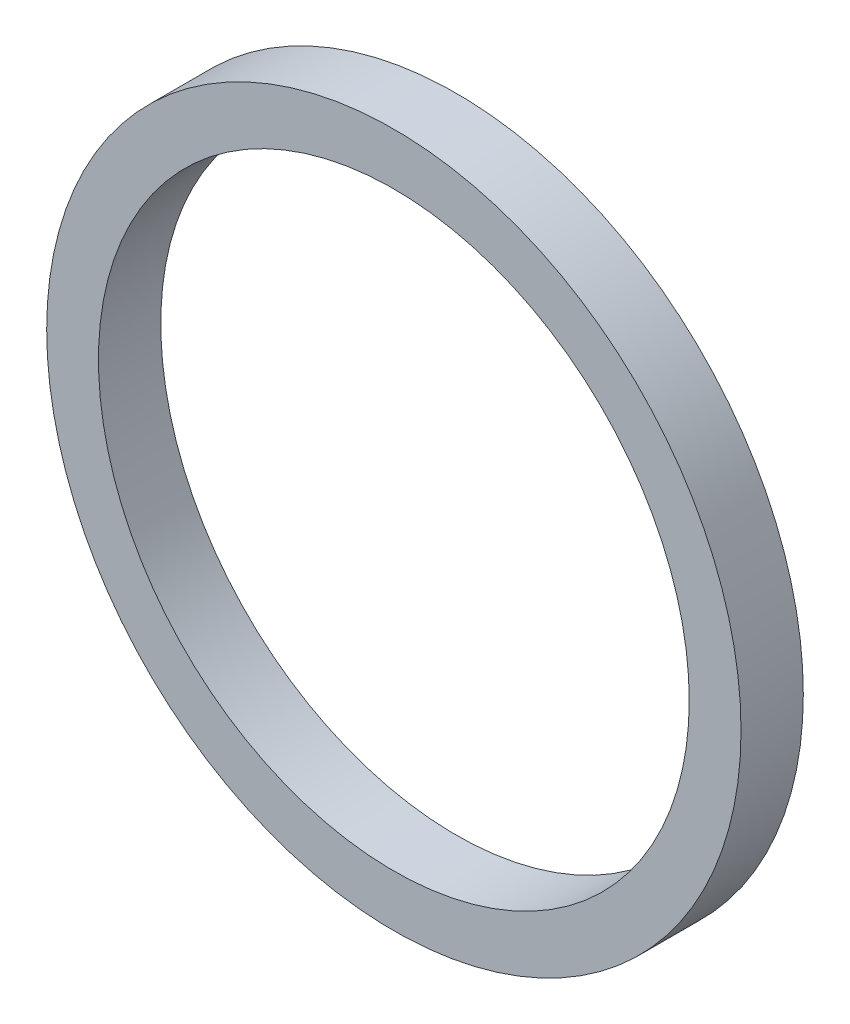
ISO-10303-21;
HEADER;
FILE_DESCRIPTION(('STEP AP214'),'2;1');
FILE_NAME('part.step','',(''),(''),'','','');
FILE_SCHEMA(('AUTOMOTIVE_DESIGN { 1 0 10303 214 1 1 1 1 }'));
ENDSEC;
DATA;
#1=APPLICATION_CONTEXT('core data for automotive mechanical design processes');
#2=APPLICATION_PROTOCOL_DEFINITION('international standard','automotive_design',2000,#1);
#3=PRODUCT_CONTEXT('',#1,'mechanical');
#4=PRODUCT('Part','Part','',(#3));
#5=PRODUCT_RELATED_PRODUCT_CATEGORY('part','',(#4));
#6=PRODUCT_DEFINITION_FORMATION('','',#4);
#7=PRODUCT_DEFINITION_CONTEXT('part definition',#1,'design');
#8=PRODUCT_DEFINITION('design','',#6,#7);
#9=PRODUCT_DEFINITION_SHAPE('','',#8);
#10=(LENGTH_UNIT() NAMED_UNIT(*) SI_UNIT(.MILLI.,.METRE.));
#11=(NAMED_UNIT(*) PLANE_ANGLE_UNIT() SI_UNIT($,.RADIAN.));
#12=(NAMED_UNIT(*) SI_UNIT($,.STERADIAN.) SOLID_ANGLE_UNIT());
#13=UNCERTAINTY_MEASURE_WITH_UNIT(LENGTH_MEASURE(1.E-05),#10,'distance_accuracy_value','');
#14=(GEOMETRIC_REPRESENTATION_CONTEXT(3) GLOBAL_UNCERTAINTY_ASSIGNED_CONTEXT((#13)) GLOBAL_UNIT_ASSIGNED_CONTEXT((#10,
#11,#12)) REPRESENTATION_CONTEXT('',''));
#15=CARTESIAN_POINT('',(0.,0.,0.));
#16=DIRECTION('',(0.,0.,1.));
#17=DIRECTION('',(1.,0.,0.));
#18=AXIS2_PLACEMENT_3D('',#15,#16,#17);
#19=CARTESIAN_POINT('',(0.,6.48351648351648,1.21175743903915));
#20=DIRECTION('',(0.,0.,1.));
#21=DIRECTION('',(1.,0.,0.));
#22=AXIS2_PLACEMENT_3D('',#19,#20,#21);
#23=PLANE('',#22);
#24=CARTESIAN_POINT('',(0.,0.,1.21175743903915));
#25=DIRECTION('',(0.,0.,1.));
#26=DIRECTION('',(1.,0.,0.));
#27=AXIS2_PLACEMENT_3D('',#24,#25,#26);
#28=CIRCLE('',#27,6.48351648351648);
#29=CARTESIAN_POINT('',(6.48351648351648,0.,1.21175743903915));
#30=VERTEX_POINT('',#29);
#31=EDGE_CURVE('E18',#30,#30,#28,.T.);
#32=ORIENTED_EDGE('',*,*,#31,.F.);
#33=EDGE_LOOP('',(#32));
#34=FACE_BOUND('',#33,.T.);
#35=CARTESIAN_POINT('',(0.,0.,1.21175743903915));
#36=DIRECTION('',(0.,0.,1.));
#37=DIRECTION('',(1.,0.,0.));
#38=AXIS2_PLACEMENT_3D('',#35,#36,#37);
#39=CIRCLE('',#38,5.51648351648352);
#40=CARTESIAN_POINT('',(5.51648351648352,0.,1.21175743903915));
#41=VERTEX_POINT('',#40);
#42=EDGE_CURVE('E27',#41,#41,#39,.T.);
#43=ORIENTED_EDGE('',*,*,#42,.T.);
#44=EDGE_LOOP('',(#43));
#45=FACE_BOUND('',#44,.T.);
#46=ADVANCED_FACE('F15',(#34,#45),#23,.F.);
#47=CARTESIAN_POINT('',(0.,0.,2.5));
#48=DIRECTION('',(0.,0.,1.));
#49=DIRECTION('',(1.,0.,0.));
#50=AXIS2_PLACEMENT_3D('',#47,#48,#49);
#51=CYLINDRICAL_SURFACE('',#50,6.48351648351648);
#52=ORIENTED_EDGE('',*,*,#31,.T.);
#53=EDGE_LOOP('',(#52));
#54=FACE_BOUND('',#53,.T.);
#55=CARTESIAN_POINT('',(0.,0.,2.375));
#56=DIRECTION('',(0.,0.,1.));
#57=DIRECTION('',(1.,0.,0.));
#58=AXIS2_PLACEMENT_3D('',#55,#56,#57);
#59=CIRCLE('',#58,6.48351648351648);
#60=CARTESIAN_POINT('',(6.48351648351648,0.,2.375));
#61=VERTEX_POINT('',#60);
#62=EDGE_CURVE('E22',#61,#61,#59,.F.);
#63=ORIENTED_EDGE('',*,*,#62,.T.);
#64=EDGE_LOOP('',(#63));
#65=FACE_BOUND('',#64,.T.);
#66=ADVANCED_FACE('F35',(#54,#65),#51,.T.);
#67=CARTESIAN_POINT('',(0.,0.,2.5));
#68=DIRECTION('',(0.,0.,1.));
#69=DIRECTION('',(1.,0.,0.));
#70=AXIS2_PLACEMENT_3D('',#67,#68,#69);
#71=CYLINDRICAL_SURFACE('',#70,5.51648351648352);
#72=ORIENTED_EDGE('',*,*,#42,.F.);
#73=EDGE_LOOP('',(#72));
#74=FACE_BOUND('',#73,.T.);
#75=CARTESIAN_POINT('',(0.,0.,2.375));
#76=DIRECTION('',(0.,0.,1.));
#77=DIRECTION('',(1.,0.,0.));
#78=AXIS2_PLACEMENT_3D('',#75,#76,#77);
#79=CIRCLE('',#78,5.51648351648352);
#80=CARTESIAN_POINT('',(5.51648351648352,0.,2.375));
#81=VERTEX_POINT('',#80);
#82=EDGE_CURVE('E10',#81,#81,#79,.T.);
#83=ORIENTED_EDGE('',*,*,#82,.T.);
#84=EDGE_LOOP('',(#83));
#85=FACE_BOUND('',#84,.T.);
#86=ADVANCED_FACE('F43',(#74,#85),#71,.F.);
#87=CARTESIAN_POINT('',(0.,6.48351648351648,2.375));
#88=DIRECTION('',(0.,0.,-1.));
#89=DIRECTION('',(-1.,0.,0.));
#90=AXIS2_PLACEMENT_3D('',#87,#88,#89);
#91=PLANE('',#90);
#92=ORIENTED_EDGE('',*,*,#82,.F.);
#93=EDGE_LOOP('',(#92));
#94=FACE_BOUND('',#93,.T.);
#95=ORIENTED_EDGE('',*,*,#62,.F.);
#96=EDGE_LOOP('',(#95));
#97=FACE_BOUND('',#96,.T.);
#98=ADVANCED_FACE('F44',(#94,#97),#91,.F.);
#99=CLOSED_SHELL('',(#46,#66,#86,#98));
#100=MANIFOLD_SOLID_BREP('B1',#99);
#101=ADVANCED_BREP_SHAPE_REPRESENTATION('',(#18,#100),#14);
#102=SHAPE_DEFINITION_REPRESENTATION(#9,#101);
ENDSEC;
END-ISO-10303-21;
